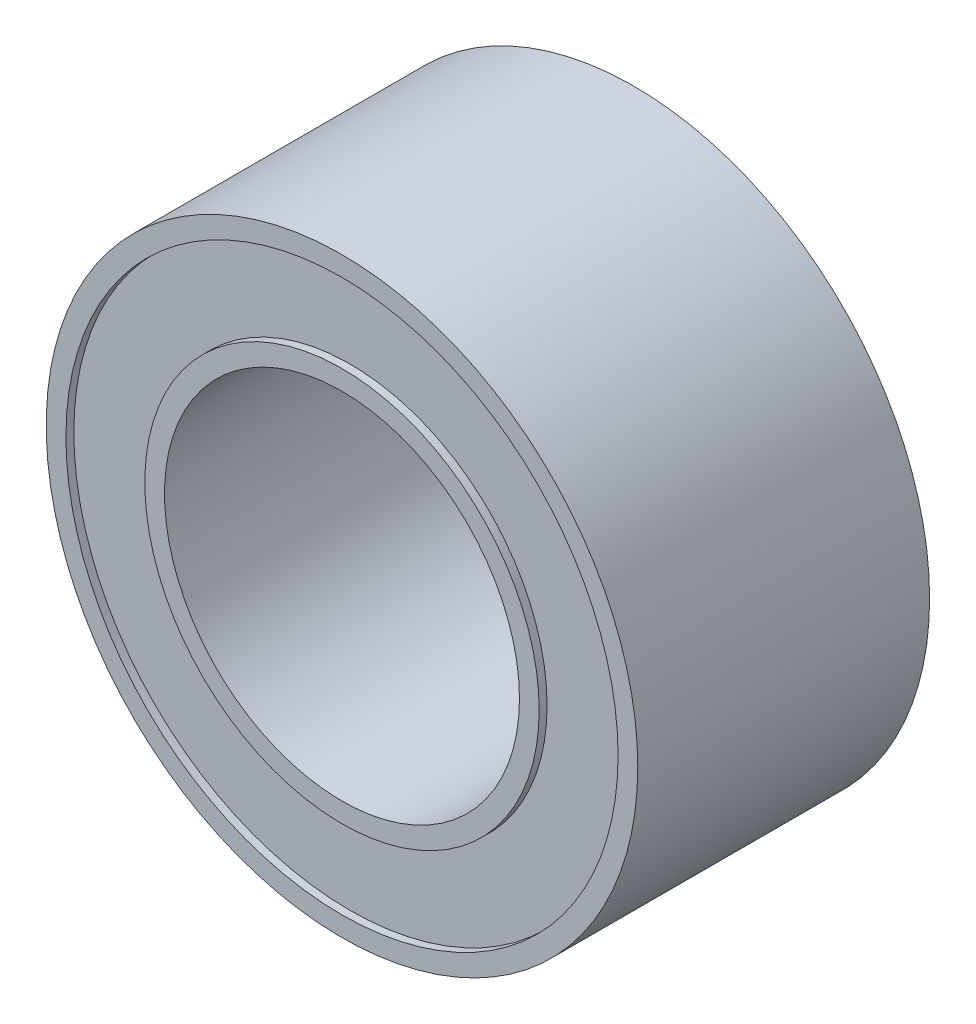
ISO-10303-21;
HEADER;
FILE_DESCRIPTION(('STEP AP214'),'2;1');
FILE_NAME('part.step','',(''),(''),'','','');
FILE_SCHEMA(('AUTOMOTIVE_DESIGN { 1 0 10303 214 1 1 1 1 }'));
ENDSEC;
DATA;
#1=APPLICATION_CONTEXT('core data for automotive mechanical design processes');
#2=APPLICATION_PROTOCOL_DEFINITION('international standard','automotive_design',2000,#1);
#3=PRODUCT_CONTEXT('',#1,'mechanical');
#4=PRODUCT('Part','Part','',(#3));
#5=PRODUCT_RELATED_PRODUCT_CATEGORY('part','',(#4));
#6=PRODUCT_DEFINITION_FORMATION('','',#4);
#7=PRODUCT_DEFINITION_CONTEXT('part definition',#1,'design');
#8=PRODUCT_DEFINITION('design','',#6,#7);
#9=PRODUCT_DEFINITION_SHAPE('','',#8);
#10=(LENGTH_UNIT() NAMED_UNIT(*) SI_UNIT(.MILLI.,.METRE.));
#11=(NAMED_UNIT(*) PLANE_ANGLE_UNIT() SI_UNIT($,.RADIAN.));
#12=(NAMED_UNIT(*) SI_UNIT($,.STERADIAN.) SOLID_ANGLE_UNIT());
#13=UNCERTAINTY_MEASURE_WITH_UNIT(LENGTH_MEASURE(1.E-05),#10,'distance_accuracy_value','');
#14=(GEOMETRIC_REPRESENTATION_CONTEXT(3) GLOBAL_UNCERTAINTY_ASSIGNED_CONTEXT((#13)) GLOBAL_UNIT_ASSIGNED_CONTEXT((#10,
#11,#12)) REPRESENTATION_CONTEXT('',''));
#15=CARTESIAN_POINT('',(0.,0.,0.));
#16=DIRECTION('',(0.,0.,1.));
#17=DIRECTION('',(1.,0.,0.));
#18=AXIS2_PLACEMENT_3D('',#15,#16,#17);
#19=CARTESIAN_POINT('',(0.,0.,0.));
#20=DIRECTION('',(0.,0.,1.));
#21=DIRECTION('',(1.,0.,0.));
#22=AXIS2_PLACEMENT_3D('',#19,#20,#21);
#23=PLANE('',#22);
#24=CARTESIAN_POINT('',(0.,0.,0.));
#25=DIRECTION('',(0.,0.,1.));
#26=DIRECTION('',(1.,0.,0.));
#27=AXIS2_PLACEMENT_3D('',#24,#25,#26);
#28=CIRCLE('',#27,22.5);
#29=CARTESIAN_POINT('',(22.5,0.,0.));
#30=VERTEX_POINT('',#29);
#31=EDGE_CURVE('E44',#30,#30,#28,.T.);
#32=ORIENTED_EDGE('',*,*,#31,.T.);
#33=EDGE_LOOP('',(#32));
#34=FACE_BOUND('',#33,.T.);
#35=CARTESIAN_POINT('',(0.,0.,0.));
#36=DIRECTION('',(0.,0.,1.));
#37=DIRECTION('',(1.,0.,0.));
#38=AXIS2_PLACEMENT_3D('',#35,#36,#37);
#39=CIRCLE('',#38,25.);
#40=CARTESIAN_POINT('',(25.,0.,0.));
#41=VERTEX_POINT('',#40);
#42=EDGE_CURVE('E68',#41,#41,#39,.T.);
#43=ORIENTED_EDGE('',*,*,#42,.F.);
#44=EDGE_LOOP('',(#43));
#45=FACE_BOUND('',#44,.T.);
#46=ADVANCED_FACE('F31',(#34,#45),#23,.F.);
#47=CARTESIAN_POINT('',(0.,0.,37.));
#48=DIRECTION('',(0.,0.,1.));
#49=DIRECTION('',(1.,0.,0.));
#50=AXIS2_PLACEMENT_3D('',#47,#48,#49);
#51=PLANE('',#50);
#52=CARTESIAN_POINT('',(0.,0.,37.));
#53=DIRECTION('',(0.,0.,1.));
#54=DIRECTION('',(1.,0.,0.));
#55=AXIS2_PLACEMENT_3D('',#52,#53,#54);
#56=CIRCLE('',#55,22.5);
#57=CARTESIAN_POINT('',(22.5,0.,37.));
#58=VERTEX_POINT('',#57);
#59=EDGE_CURVE('E42',#58,#58,#56,.T.);
#60=ORIENTED_EDGE('',*,*,#59,.F.);
#61=EDGE_LOOP('',(#60));
#62=FACE_BOUND('',#61,.T.);
#63=CARTESIAN_POINT('',(0.,0.,37.));
#64=DIRECTION('',(0.,0.,1.));
#65=DIRECTION('',(1.,0.,0.));
#66=AXIS2_PLACEMENT_3D('',#63,#64,#65);
#67=CIRCLE('',#66,25.);
#68=CARTESIAN_POINT('',(25.,0.,37.));
#69=VERTEX_POINT('',#68);
#70=EDGE_CURVE('E56',#69,#69,#67,.T.);
#71=ORIENTED_EDGE('',*,*,#70,.T.);
#72=EDGE_LOOP('',(#71));
#73=FACE_BOUND('',#72,.T.);
#74=ADVANCED_FACE('F84',(#62,#73),#51,.T.);
#75=CARTESIAN_POINT('',(0.,0.,37.));
#76=DIRECTION('',(0.,0.,1.));
#77=DIRECTION('',(1.,0.,0.));
#78=AXIS2_PLACEMENT_3D('',#75,#76,#77);
#79=CIRCLE('',#78,35.);
#80=CARTESIAN_POINT('',(35.,0.,37.));
#81=VERTEX_POINT('',#80);
#82=EDGE_CURVE('E50',#81,#81,#79,.T.);
#83=ORIENTED_EDGE('',*,*,#82,.F.);
#84=EDGE_LOOP('',(#83));
#85=FACE_BOUND('',#84,.T.);
#86=CARTESIAN_POINT('',(0.,0.,37.));
#87=DIRECTION('',(0.,0.,1.));
#88=DIRECTION('',(1.,0.,0.));
#89=AXIS2_PLACEMENT_3D('',#86,#87,#88);
#90=CIRCLE('',#89,37.5);
#91=CARTESIAN_POINT('',(37.5,0.,37.));
#92=VERTEX_POINT('',#91);
#93=EDGE_CURVE('E10',#92,#92,#90,.T.);
#94=ORIENTED_EDGE('',*,*,#93,.T.);
#95=EDGE_LOOP('',(#94));
#96=FACE_BOUND('',#95,.T.);
#97=ADVANCED_FACE('F90',(#85,#96),#51,.T.);
#98=CARTESIAN_POINT('',(0.,0.,0.));
#99=DIRECTION('',(0.,0.,1.));
#100=DIRECTION('',(1.,0.,0.));
#101=AXIS2_PLACEMENT_3D('',#98,#99,#100);
#102=CIRCLE('',#101,35.);
#103=CARTESIAN_POINT('',(35.,0.,0.));
#104=VERTEX_POINT('',#103);
#105=EDGE_CURVE('E62',#104,#104,#102,.T.);
#106=ORIENTED_EDGE('',*,*,#105,.T.);
#107=EDGE_LOOP('',(#106));
#108=FACE_BOUND('',#107,.T.);
#109=CARTESIAN_POINT('',(0.,0.,0.));
#110=DIRECTION('',(0.,0.,1.));
#111=DIRECTION('',(1.,0.,0.));
#112=AXIS2_PLACEMENT_3D('',#109,#110,#111);
#113=CIRCLE('',#112,37.5);
#114=CARTESIAN_POINT('',(37.5,0.,0.));
#115=VERTEX_POINT('',#114);
#116=EDGE_CURVE('E35',#115,#115,#113,.T.);
#117=ORIENTED_EDGE('',*,*,#116,.F.);
#118=EDGE_LOOP('',(#117));
#119=FACE_BOUND('',#118,.T.);
#120=ADVANCED_FACE('F86',(#108,#119),#23,.F.);
#121=CARTESIAN_POINT('',(0.,0.,37.));
#122=DIRECTION('',(0.,0.,-1.));
#123=DIRECTION('',(-1.,0.,0.));
#124=AXIS2_PLACEMENT_3D('',#121,#122,#123);
#125=CYLINDRICAL_SURFACE('',#124,37.5);
#126=ORIENTED_EDGE('',*,*,#93,.F.);
#127=EDGE_LOOP('',(#126));
#128=FACE_BOUND('',#127,.T.);
#129=ORIENTED_EDGE('',*,*,#116,.T.);
#130=EDGE_LOOP('',(#129));
#131=FACE_BOUND('',#130,.T.);
#132=ADVANCED_FACE('F33',(#128,#131),#125,.T.);
#133=CARTESIAN_POINT('',(0.,0.,37.));
#134=DIRECTION('',(0.,0.,-1.));
#135=DIRECTION('',(-1.,0.,0.));
#136=AXIS2_PLACEMENT_3D('',#133,#134,#135);
#137=CYLINDRICAL_SURFACE('',#136,22.5);
#138=ORIENTED_EDGE('',*,*,#59,.T.);
#139=EDGE_LOOP('',(#138));
#140=FACE_BOUND('',#139,.T.);
#141=ORIENTED_EDGE('',*,*,#31,.F.);
#142=EDGE_LOOP('',(#141));
#143=FACE_BOUND('',#142,.T.);
#144=ADVANCED_FACE('F99',(#140,#143),#137,.F.);
#145=CARTESIAN_POINT('',(0.,0.,36.));
#146=DIRECTION('',(0.,0.,1.));
#147=DIRECTION('',(1.,0.,0.));
#148=AXIS2_PLACEMENT_3D('',#145,#146,#147);
#149=CYLINDRICAL_SURFACE('',#148,35.);
#150=CARTESIAN_POINT('',(0.,0.,36.));
#151=DIRECTION('',(0.,0.,1.));
#152=DIRECTION('',(1.,0.,0.));
#153=AXIS2_PLACEMENT_3D('',#150,#151,#152);
#154=CIRCLE('',#153,35.);
#155=CARTESIAN_POINT('',(35.,0.,36.));
#156=VERTEX_POINT('',#155);
#157=EDGE_CURVE('E47',#156,#156,#154,.T.);
#158=ORIENTED_EDGE('',*,*,#157,.F.);
#159=EDGE_LOOP('',(#158));
#160=FACE_BOUND('',#159,.T.);
#161=ORIENTED_EDGE('',*,*,#82,.T.);
#162=EDGE_LOOP('',(#161));
#163=FACE_BOUND('',#162,.T.);
#164=ADVANCED_FACE('F123',(#160,#163),#149,.F.);
#165=CARTESIAN_POINT('',(0.,0.,36.));
#166=DIRECTION('',(0.,0.,1.));
#167=DIRECTION('',(1.,0.,0.));
#168=AXIS2_PLACEMENT_3D('',#165,#166,#167);
#169=PLANE('',#168);
#170=CARTESIAN_POINT('',(0.,0.,36.));
#171=DIRECTION('',(0.,0.,1.));
#172=DIRECTION('',(1.,0.,0.));
#173=AXIS2_PLACEMENT_3D('',#170,#171,#172);
#174=CIRCLE('',#173,25.);
#175=CARTESIAN_POINT('',(25.,0.,36.));
#176=VERTEX_POINT('',#175);
#177=EDGE_CURVE('E53',#176,#176,#174,.T.);
#178=ORIENTED_EDGE('',*,*,#177,.F.);
#179=EDGE_LOOP('',(#178));
#180=FACE_BOUND('',#179,.T.);
#181=ORIENTED_EDGE('',*,*,#157,.T.);
#182=EDGE_LOOP('',(#181));
#183=FACE_BOUND('',#182,.T.);
#184=ADVANCED_FACE('F119',(#180,#183),#169,.T.);
#185=CARTESIAN_POINT('',(0.,0.,36.));
#186=DIRECTION('',(0.,0.,1.));
#187=DIRECTION('',(1.,0.,0.));
#188=AXIS2_PLACEMENT_3D('',#185,#186,#187);
#189=CYLINDRICAL_SURFACE('',#188,25.);
#190=ORIENTED_EDGE('',*,*,#177,.T.);
#191=EDGE_LOOP('',(#190));
#192=FACE_BOUND('',#191,.T.);
#193=ORIENTED_EDGE('',*,*,#70,.F.);
#194=EDGE_LOOP('',(#193));
#195=FACE_BOUND('',#194,.T.);
#196=ADVANCED_FACE('F113',(#192,#195),#189,.T.);
#197=CARTESIAN_POINT('',(0.,0.,1.));
#198=DIRECTION('',(0.,0.,-1.));
#199=DIRECTION('',(1.,0.,0.));
#200=AXIS2_PLACEMENT_3D('',#197,#198,#199);
#201=PLANE('',#200);
#202=CARTESIAN_POINT('',(0.,0.,1.));
#203=DIRECTION('',(0.,0.,1.));
#204=DIRECTION('',(1.,0.,0.));
#205=AXIS2_PLACEMENT_3D('',#202,#203,#204);
#206=CIRCLE('',#205,35.);
#207=CARTESIAN_POINT('',(35.,0.,1.));
#208=VERTEX_POINT('',#207);
#209=EDGE_CURVE('E59',#208,#208,#206,.T.);
#210=ORIENTED_EDGE('',*,*,#209,.F.);
#211=EDGE_LOOP('',(#210));
#212=FACE_BOUND('',#211,.T.);
#213=CARTESIAN_POINT('',(0.,0.,1.));
#214=DIRECTION('',(0.,0.,1.));
#215=DIRECTION('',(1.,0.,0.));
#216=AXIS2_PLACEMENT_3D('',#213,#214,#215);
#217=CIRCLE('',#216,25.);
#218=CARTESIAN_POINT('',(25.,0.,1.));
#219=VERTEX_POINT('',#218);
#220=EDGE_CURVE('E65',#219,#219,#217,.T.);
#221=ORIENTED_EDGE('',*,*,#220,.T.);
#222=EDGE_LOOP('',(#221));
#223=FACE_BOUND('',#222,.T.);
#224=ADVANCED_FACE('F74',(#212,#223),#201,.T.);
#225=CARTESIAN_POINT('',(0.,0.,1.));
#226=DIRECTION('',(0.,0.,-1.));
#227=DIRECTION('',(-1.,0.,0.));
#228=AXIS2_PLACEMENT_3D('',#225,#226,#227);
#229=CYLINDRICAL_SURFACE('',#228,35.);
#230=ORIENTED_EDGE('',*,*,#209,.T.);
#231=EDGE_LOOP('',(#230));
#232=FACE_BOUND('',#231,.T.);
#233=ORIENTED_EDGE('',*,*,#105,.F.);
#234=EDGE_LOOP('',(#233));
#235=FACE_BOUND('',#234,.T.);
#236=ADVANCED_FACE('F79',(#232,#235),#229,.F.);
#237=CARTESIAN_POINT('',(0.,0.,1.));
#238=DIRECTION('',(0.,0.,-1.));
#239=DIRECTION('',(-1.,0.,0.));
#240=AXIS2_PLACEMENT_3D('',#237,#238,#239);
#241=CYLINDRICAL_SURFACE('',#240,25.);
#242=ORIENTED_EDGE('',*,*,#220,.F.);
#243=EDGE_LOOP('',(#242));
#244=FACE_BOUND('',#243,.T.);
#245=ORIENTED_EDGE('',*,*,#42,.T.);
#246=EDGE_LOOP('',(#245));
#247=FACE_BOUND('',#246,.T.);
#248=ADVANCED_FACE('F76',(#244,#247),#241,.T.);
#249=CLOSED_SHELL('',(#46,#74,#97,#120,#132,#144,#164,#184,#196,#224,#236,#248));
#250=MANIFOLD_SOLID_BREP('B2',#249);
#251=ADVANCED_BREP_SHAPE_REPRESENTATION('',(#18,#250),#14);
#252=SHAPE_DEFINITION_REPRESENTATION(#9,#251);
ENDSEC;
END-ISO-10303-21;
